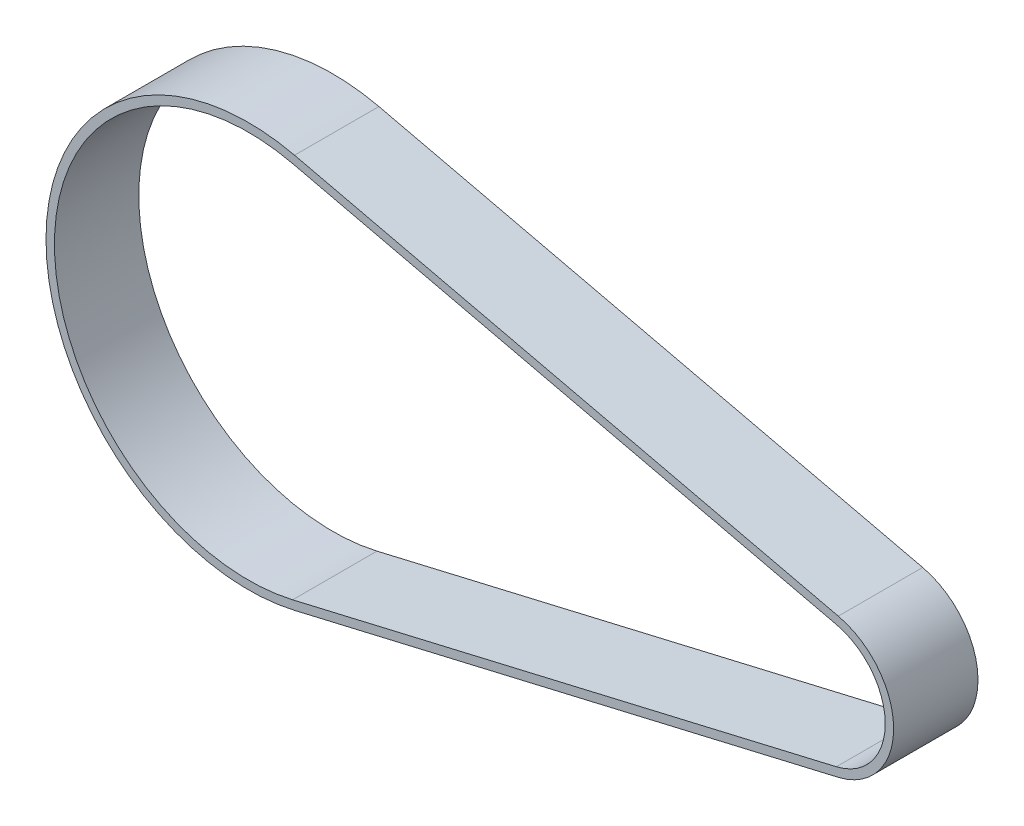
ISO-10303-21;
HEADER;
FILE_DESCRIPTION(('STEP AP214'),'2;1');
FILE_NAME('part.step','',(''),(''),'','','');
FILE_SCHEMA(('AUTOMOTIVE_DESIGN { 1 0 10303 214 1 1 1 1 }'));
ENDSEC;
DATA;
#1=APPLICATION_CONTEXT('core data for automotive mechanical design processes');
#2=APPLICATION_PROTOCOL_DEFINITION('international standard','automotive_design',2000,#1);
#3=PRODUCT_CONTEXT('',#1,'mechanical');
#4=PRODUCT('Part','Part','',(#3));
#5=PRODUCT_RELATED_PRODUCT_CATEGORY('part','',(#4));
#6=PRODUCT_DEFINITION_FORMATION('','',#4);
#7=PRODUCT_DEFINITION_CONTEXT('part definition',#1,'design');
#8=PRODUCT_DEFINITION('design','',#6,#7);
#9=PRODUCT_DEFINITION_SHAPE('','',#8);
#10=(LENGTH_UNIT() NAMED_UNIT(*) SI_UNIT(.MILLI.,.METRE.));
#11=(NAMED_UNIT(*) PLANE_ANGLE_UNIT() SI_UNIT($,.RADIAN.));
#12=(NAMED_UNIT(*) SI_UNIT($,.STERADIAN.) SOLID_ANGLE_UNIT());
#13=UNCERTAINTY_MEASURE_WITH_UNIT(LENGTH_MEASURE(1.E-05),#10,'distance_accuracy_value','');
#14=(GEOMETRIC_REPRESENTATION_CONTEXT(3) GLOBAL_UNCERTAINTY_ASSIGNED_CONTEXT((#13)) GLOBAL_UNIT_ASSIGNED_CONTEXT((#10,
#11,#12)) REPRESENTATION_CONTEXT('',''));
#15=CARTESIAN_POINT('',(0.,0.,0.));
#16=DIRECTION('',(0.,0.,1.));
#17=DIRECTION('',(1.,0.,0.));
#18=AXIS2_PLACEMENT_3D('',#15,#16,#17);
#19=CARTESIAN_POINT('',(5.47058823529412,23.3681977131284,10.));
#20=DIRECTION('',(-0.227941176470588,-0.973674904713685,0.));
#21=DIRECTION('',(0.973674904713685,-0.227941176470588,0.));
#22=AXIS2_PLACEMENT_3D('',#19,#20,#21);
#23=PLANE('',#22);
#24=DIRECTION('',(0.,0.,-1.));
#25=VECTOR('',#24,1.);
#26=CARTESIAN_POINT('',(5.47058823529412,23.3681977131284,10.));
#27=LINE('',#26,#25);
#28=CARTESIAN_POINT('',(5.47058823529412,23.3681977131284,10.));
#29=VERTEX_POINT('',#28);
#30=CARTESIAN_POINT('',(5.47058823529412,23.3681977131284,0.));
#31=VERTEX_POINT('',#30);
#32=EDGE_CURVE('E116',#29,#31,#27,.T.);
#33=ORIENTED_EDGE('',*,*,#32,.F.);
#34=DIRECTION('',(-0.973674904713685,0.227941176470588,0.));
#35=VECTOR('',#34,1.);
#36=CARTESIAN_POINT('',(69.9375,8.27623669006632,10.));
#37=LINE('',#36,#35);
#38=CARTESIAN_POINT('',(69.9375,8.27623669006632,10.));
#39=VERTEX_POINT('',#38);
#40=EDGE_CURVE('E74',#39,#29,#37,.T.);
#41=ORIENTED_EDGE('',*,*,#40,.F.);
#42=DIRECTION('',(0.,0.,-1.));
#43=VECTOR('',#42,1.);
#44=CARTESIAN_POINT('',(69.9375,8.27623669006632,10.));
#45=LINE('',#44,#43);
#46=CARTESIAN_POINT('',(69.9375,8.27623669006632,0.));
#47=VERTEX_POINT('',#46);
#48=EDGE_CURVE('E118',#47,#39,#45,.F.);
#49=ORIENTED_EDGE('',*,*,#48,.F.);
#50=DIRECTION('',(-0.973674904713685,0.227941176470588,0.));
#51=VECTOR('',#50,1.);
#52=CARTESIAN_POINT('',(69.9375,8.27623669006632,0.));
#53=LINE('',#52,#51);
#54=EDGE_CURVE('E126',#47,#31,#53,.T.);
#55=ORIENTED_EDGE('',*,*,#54,.T.);
#56=EDGE_LOOP('',(#33,#41,#49,#55));
#57=FACE_BOUND('',#56,.T.);
#58=ADVANCED_FACE('F17',(#57),#23,.F.);
#59=CARTESIAN_POINT('',(5.24264705882353,22.3945228084148,10.));
#60=DIRECTION('',(-0.227941176470588,-0.973674904713685,0.));
#61=DIRECTION('',(0.973674904713685,-0.227941176470588,0.));
#62=AXIS2_PLACEMENT_3D('',#59,#60,#61);
#63=PLANE('',#62);
#64=DIRECTION('',(0.973674904713685,-0.227941176470588,0.));
#65=VECTOR('',#64,1.);
#66=CARTESIAN_POINT('',(5.24264705882353,22.3945228084148,10.));
#67=LINE('',#66,#65);
#68=CARTESIAN_POINT('',(5.24264705882353,22.3945228084148,10.));
#69=VERTEX_POINT('',#68);
#70=CARTESIAN_POINT('',(69.7095588235294,7.30256178535264,10.));
#71=VERTEX_POINT('',#70);
#72=EDGE_CURVE('E97',#69,#71,#67,.T.);
#73=ORIENTED_EDGE('',*,*,#72,.F.);
#74=DIRECTION('',(0.,0.,-1.));
#75=VECTOR('',#74,1.);
#76=CARTESIAN_POINT('',(5.24264705882353,22.3945228084148,10.));
#77=LINE('',#76,#75);
#78=CARTESIAN_POINT('',(5.24264705882353,22.3945228084148,0.));
#79=VERTEX_POINT('',#78);
#80=EDGE_CURVE('E79',#69,#79,#77,.T.);
#81=ORIENTED_EDGE('',*,*,#80,.T.);
#82=DIRECTION('',(0.973674904713685,-0.227941176470588,0.));
#83=VECTOR('',#82,1.);
#84=CARTESIAN_POINT('',(5.24264705882353,22.3945228084148,0.));
#85=LINE('',#84,#83);
#86=CARTESIAN_POINT('',(69.7095588235294,7.30256178535264,0.));
#87=VERTEX_POINT('',#86);
#88=EDGE_CURVE('E124',#79,#87,#85,.T.);
#89=ORIENTED_EDGE('',*,*,#88,.T.);
#90=DIRECTION('',(0.,0.,-1.));
#91=VECTOR('',#90,1.);
#92=CARTESIAN_POINT('',(69.7095588235294,7.30256178535264,10.));
#93=LINE('',#92,#91);
#94=EDGE_CURVE('E113',#87,#71,#93,.F.);
#95=ORIENTED_EDGE('',*,*,#94,.T.);
#96=EDGE_LOOP('',(#73,#81,#89,#95));
#97=FACE_BOUND('',#96,.T.);
#98=ADVANCED_FACE('F137',(#97),#63,.T.);
#99=CARTESIAN_POINT('',(68.,0.,10.));
#100=DIRECTION('',(0.,0.,-1.));
#101=DIRECTION('',(-1.,0.,0.));
#102=AXIS2_PLACEMENT_3D('',#99,#100,#101);
#103=CYLINDRICAL_SURFACE('',#102,7.5);
#104=DIRECTION('',(0.,0.,1.));
#105=VECTOR('',#104,1.);
#106=CARTESIAN_POINT('',(69.7095588235294,-7.30256178535263,10.));
#107=LINE('',#106,#105);
#108=CARTESIAN_POINT('',(69.7095588235294,-7.30256178535263,10.));
#109=VERTEX_POINT('',#108);
#110=CARTESIAN_POINT('',(69.7095588235294,-7.30256178535263,0.));
#111=VERTEX_POINT('',#110);
#112=EDGE_CURVE('E110',#109,#111,#107,.F.);
#113=ORIENTED_EDGE('',*,*,#112,.F.);
#114=CARTESIAN_POINT('',(68.,0.,10.));
#115=DIRECTION('',(0.,0.,-1.));
#116=DIRECTION('',(-1.,0.,0.));
#117=AXIS2_PLACEMENT_3D('',#114,#115,#116);
#118=CIRCLE('',#117,7.5);
#119=EDGE_CURVE('E99',#71,#109,#118,.T.);
#120=ORIENTED_EDGE('',*,*,#119,.F.);
#121=ORIENTED_EDGE('',*,*,#94,.F.);
#122=CARTESIAN_POINT('',(68.,0.,0.));
#123=DIRECTION('',(0.,0.,-1.));
#124=DIRECTION('',(-1.,0.,0.));
#125=AXIS2_PLACEMENT_3D('',#122,#123,#124);
#126=CIRCLE('',#125,7.5);
#127=EDGE_CURVE('E121',#87,#111,#126,.T.);
#128=ORIENTED_EDGE('',*,*,#127,.T.);
#129=EDGE_LOOP('',(#113,#120,#121,#128));
#130=FACE_BOUND('',#129,.T.);
#131=ADVANCED_FACE('F146',(#130),#103,.F.);
#132=CARTESIAN_POINT('',(5.24264705882353,-22.3945228084148,10.));
#133=DIRECTION('',(-0.227941176470588,0.973674904713685,0.));
#134=DIRECTION('',(-0.973674904713685,-0.227941176470588,0.));
#135=AXIS2_PLACEMENT_3D('',#132,#133,#134);
#136=PLANE('',#135);
#137=DIRECTION('',(-0.973674904713685,-0.227941176470588,0.));
#138=VECTOR('',#137,1.);
#139=CARTESIAN_POINT('',(69.7095588235294,-7.30256178535264,10.));
#140=LINE('',#139,#138);
#141=CARTESIAN_POINT('',(5.24264705882352,-22.3945228084148,10.));
#142=VERTEX_POINT('',#141);
#143=EDGE_CURVE('E101',#109,#142,#140,.T.);
#144=ORIENTED_EDGE('',*,*,#143,.F.);
#145=ORIENTED_EDGE('',*,*,#112,.T.);
#146=DIRECTION('',(-0.973674904713685,-0.227941176470588,0.));
#147=VECTOR('',#146,1.);
#148=CARTESIAN_POINT('',(69.7095588235294,-7.30256178535264,0.));
#149=LINE('',#148,#147);
#150=CARTESIAN_POINT('',(5.24264705882353,-22.3945228084148,0.));
#151=VERTEX_POINT('',#150);
#152=EDGE_CURVE('E93',#111,#151,#149,.T.);
#153=ORIENTED_EDGE('',*,*,#152,.T.);
#154=DIRECTION('',(0.,0.,-1.));
#155=VECTOR('',#154,1.);
#156=CARTESIAN_POINT('',(5.24264705882352,-22.3945228084148,10.));
#157=LINE('',#156,#155);
#158=EDGE_CURVE('E107',#151,#142,#157,.F.);
#159=ORIENTED_EDGE('',*,*,#158,.T.);
#160=EDGE_LOOP('',(#144,#145,#153,#159));
#161=FACE_BOUND('',#160,.T.);
#162=ADVANCED_FACE('F148',(#161),#136,.T.);
#163=CARTESIAN_POINT('',(0.,0.,10.));
#164=DIRECTION('',(0.,0.,-1.));
#165=DIRECTION('',(-1.,0.,0.));
#166=AXIS2_PLACEMENT_3D('',#163,#164,#165);
#167=CYLINDRICAL_SURFACE('',#166,23.);
#168=CARTESIAN_POINT('',(0.,0.,10.));
#169=DIRECTION('',(0.,0.,-1.));
#170=DIRECTION('',(-1.,0.,0.));
#171=AXIS2_PLACEMENT_3D('',#168,#169,#170);
#172=CIRCLE('',#171,23.);
#173=EDGE_CURVE('E100',#142,#69,#172,.T.);
#174=ORIENTED_EDGE('',*,*,#173,.F.);
#175=ORIENTED_EDGE('',*,*,#158,.F.);
#176=CARTESIAN_POINT('',(0.,0.,0.));
#177=DIRECTION('',(0.,0.,-1.));
#178=DIRECTION('',(-1.,0.,0.));
#179=AXIS2_PLACEMENT_3D('',#176,#177,#178);
#180=CIRCLE('',#179,23.);
#181=EDGE_CURVE('E90',#151,#79,#180,.T.);
#182=ORIENTED_EDGE('',*,*,#181,.T.);
#183=ORIENTED_EDGE('',*,*,#80,.F.);
#184=EDGE_LOOP('',(#174,#175,#182,#183));
#185=FACE_BOUND('',#184,.T.);
#186=ADVANCED_FACE('F152',(#185),#167,.F.);
#187=CARTESIAN_POINT('',(0.,0.,10.));
#188=DIRECTION('',(0.,0.,-1.));
#189=DIRECTION('',(-1.,0.,0.));
#190=AXIS2_PLACEMENT_3D('',#187,#188,#189);
#191=CYLINDRICAL_SURFACE('',#190,24.);
#192=CARTESIAN_POINT('',(0.,0.,0.));
#193=DIRECTION('',(0.,0.,-1.));
#194=DIRECTION('',(-1.,0.,0.));
#195=AXIS2_PLACEMENT_3D('',#192,#193,#194);
#196=CIRCLE('',#195,24.);
#197=CARTESIAN_POINT('',(5.47058823529412,-23.3681977131284,0.));
#198=VERTEX_POINT('',#197);
#199=EDGE_CURVE('E89',#31,#198,#196,.F.);
#200=ORIENTED_EDGE('',*,*,#199,.T.);
#201=DIRECTION('',(0.,0.,1.));
#202=VECTOR('',#201,1.);
#203=CARTESIAN_POINT('',(5.47058823529412,-23.3681977131284,10.));
#204=LINE('',#203,#202);
#205=CARTESIAN_POINT('',(5.47058823529412,-23.3681977131284,10.));
#206=VERTEX_POINT('',#205);
#207=EDGE_CURVE('E84',#198,#206,#204,.T.);
#208=ORIENTED_EDGE('',*,*,#207,.T.);
#209=CARTESIAN_POINT('',(0.,0.,10.));
#210=DIRECTION('',(0.,0.,-1.));
#211=DIRECTION('',(-1.,0.,0.));
#212=AXIS2_PLACEMENT_3D('',#209,#210,#211);
#213=CIRCLE('',#212,24.);
#214=EDGE_CURVE('E20',#29,#206,#213,.F.);
#215=ORIENTED_EDGE('',*,*,#214,.F.);
#216=ORIENTED_EDGE('',*,*,#32,.T.);
#217=EDGE_LOOP('',(#200,#208,#215,#216));
#218=FACE_BOUND('',#217,.T.);
#219=ADVANCED_FACE('F87',(#218),#191,.T.);
#220=CARTESIAN_POINT('',(0.,0.,10.));
#221=DIRECTION('',(0.,0.,1.));
#222=DIRECTION('',(1.,0.,0.));
#223=AXIS2_PLACEMENT_3D('',#220,#221,#222);
#224=PLANE('',#223);
#225=ORIENTED_EDGE('',*,*,#72,.T.);
#226=ORIENTED_EDGE('',*,*,#119,.T.);
#227=ORIENTED_EDGE('',*,*,#143,.T.);
#228=ORIENTED_EDGE('',*,*,#173,.T.);
#229=EDGE_LOOP('',(#225,#226,#227,#228));
#230=FACE_BOUND('',#229,.T.);
#231=CARTESIAN_POINT('',(68.,0.,10.));
#232=DIRECTION('',(0.,0.,-1.));
#233=DIRECTION('',(-1.,0.,0.));
#234=AXIS2_PLACEMENT_3D('',#231,#232,#233);
#235=CIRCLE('',#234,8.49999999999999);
#236=CARTESIAN_POINT('',(69.9375,-8.27623669006632,10.));
#237=VERTEX_POINT('',#236);
#238=EDGE_CURVE('E119',#39,#237,#235,.T.);
#239=ORIENTED_EDGE('',*,*,#238,.F.);
#240=ORIENTED_EDGE('',*,*,#40,.T.);
#241=ORIENTED_EDGE('',*,*,#214,.T.);
#242=DIRECTION('',(-0.973674904713685,-0.227941176470588,0.));
#243=VECTOR('',#242,1.);
#244=CARTESIAN_POINT('',(5.47058823529412,-23.3681977131284,10.));
#245=LINE('',#244,#243);
#246=EDGE_CURVE('E72',#206,#237,#245,.F.);
#247=ORIENTED_EDGE('',*,*,#246,.T.);
#248=EDGE_LOOP('',(#239,#240,#241,#247));
#249=FACE_BOUND('',#248,.T.);
#250=ADVANCED_FACE('F71',(#230,#249),#224,.T.);
#251=CARTESIAN_POINT('',(68.,0.,10.));
#252=DIRECTION('',(0.,0.,-1.));
#253=DIRECTION('',(-1.,0.,0.));
#254=AXIS2_PLACEMENT_3D('',#251,#252,#253);
#255=CYLINDRICAL_SURFACE('',#254,8.49999999999999);
#256=ORIENTED_EDGE('',*,*,#238,.T.);
#257=DIRECTION('',(0.,0.,1.));
#258=VECTOR('',#257,1.);
#259=CARTESIAN_POINT('',(69.9375,-8.27623669006632,10.));
#260=LINE('',#259,#258);
#261=CARTESIAN_POINT('',(69.9375,-8.27623669006632,0.));
#262=VERTEX_POINT('',#261);
#263=EDGE_CURVE('E26',#237,#262,#260,.F.);
#264=ORIENTED_EDGE('',*,*,#263,.T.);
#265=CARTESIAN_POINT('',(68.,0.,0.));
#266=DIRECTION('',(0.,0.,-1.));
#267=DIRECTION('',(-1.,0.,0.));
#268=AXIS2_PLACEMENT_3D('',#265,#266,#267);
#269=CIRCLE('',#268,8.49999999999999);
#270=EDGE_CURVE('E34',#262,#47,#269,.F.);
#271=ORIENTED_EDGE('',*,*,#270,.T.);
#272=ORIENTED_EDGE('',*,*,#48,.T.);
#273=EDGE_LOOP('',(#256,#264,#271,#272));
#274=FACE_BOUND('',#273,.T.);
#275=ADVANCED_FACE('F165',(#274),#255,.T.);
#276=CARTESIAN_POINT('',(0.,0.,0.));
#277=DIRECTION('',(0.,0.,1.));
#278=DIRECTION('',(1.,0.,0.));
#279=AXIS2_PLACEMENT_3D('',#276,#277,#278);
#280=PLANE('',#279);
#281=ORIENTED_EDGE('',*,*,#181,.F.);
#282=ORIENTED_EDGE('',*,*,#152,.F.);
#283=ORIENTED_EDGE('',*,*,#127,.F.);
#284=ORIENTED_EDGE('',*,*,#88,.F.);
#285=EDGE_LOOP('',(#281,#282,#283,#284));
#286=FACE_BOUND('',#285,.T.);
#287=ORIENTED_EDGE('',*,*,#54,.F.);
#288=ORIENTED_EDGE('',*,*,#270,.F.);
#289=DIRECTION('',(-0.973674904713685,-0.227941176470588,0.));
#290=VECTOR('',#289,1.);
#291=CARTESIAN_POINT('',(5.47058823529412,-23.3681977131284,0.));
#292=LINE('',#291,#290);
#293=EDGE_CURVE('E11',#262,#198,#292,.T.);
#294=ORIENTED_EDGE('',*,*,#293,.T.);
#295=ORIENTED_EDGE('',*,*,#199,.F.);
#296=EDGE_LOOP('',(#287,#288,#294,#295));
#297=FACE_BOUND('',#296,.T.);
#298=ADVANCED_FACE('F160',(#286,#297),#280,.F.);
#299=CARTESIAN_POINT('',(5.47058823529412,-23.3681977131284,10.));
#300=DIRECTION('',(-0.227941176470588,0.973674904713685,0.));
#301=DIRECTION('',(-0.973674904713685,-0.227941176470588,0.));
#302=AXIS2_PLACEMENT_3D('',#299,#300,#301);
#303=PLANE('',#302);
#304=ORIENTED_EDGE('',*,*,#263,.F.);
#305=ORIENTED_EDGE('',*,*,#246,.F.);
#306=ORIENTED_EDGE('',*,*,#207,.F.);
#307=ORIENTED_EDGE('',*,*,#293,.F.);
#308=EDGE_LOOP('',(#304,#305,#306,#307));
#309=FACE_BOUND('',#308,.T.);
#310=ADVANCED_FACE('F83',(#309),#303,.F.);
#311=CLOSED_SHELL('',(#58,#98,#131,#162,#186,#219,#250,#275,#298,#310));
#312=MANIFOLD_SOLID_BREP('B1',#311);
#313=ADVANCED_BREP_SHAPE_REPRESENTATION('',(#18,#312),#14);
#314=SHAPE_DEFINITION_REPRESENTATION(#9,#313);
ENDSEC;
END-ISO-10303-21;
